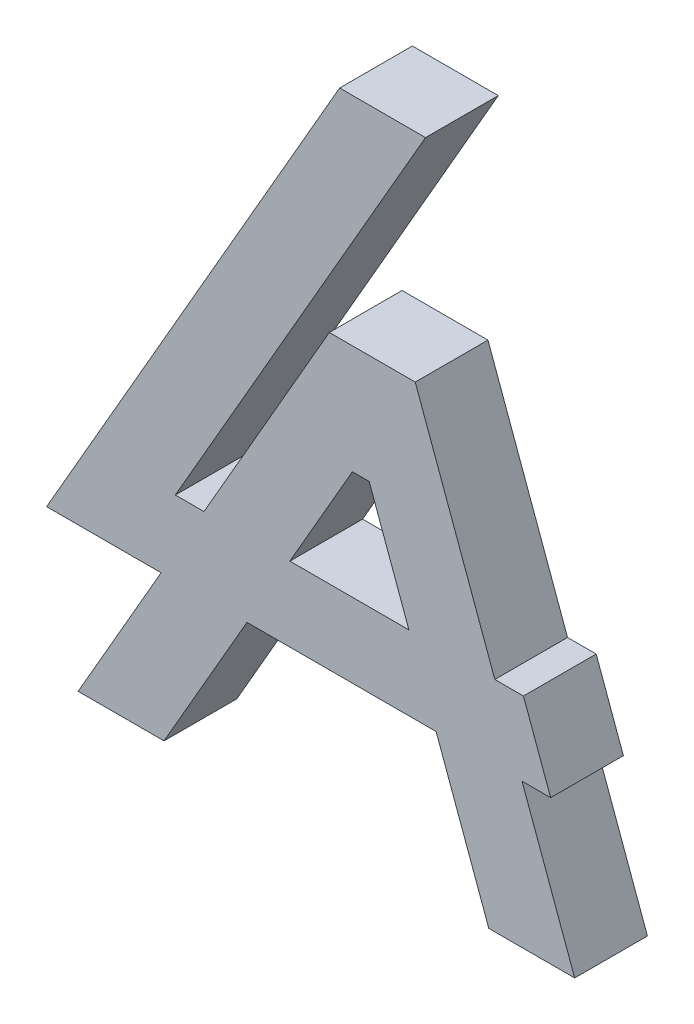
ISO-10303-21;
HEADER;
FILE_DESCRIPTION(('STEP AP214'),'2;1');
FILE_NAME('part.step','',(''),(''),'','','');
FILE_SCHEMA(('AUTOMOTIVE_DESIGN { 1 0 10303 214 1 1 1 1 }'));
ENDSEC;
DATA;
#1=APPLICATION_CONTEXT('core data for automotive mechanical design processes');
#2=APPLICATION_PROTOCOL_DEFINITION('international standard','automotive_design',2000,#1);
#3=PRODUCT_CONTEXT('',#1,'mechanical');
#4=PRODUCT('Part','Part','',(#3));
#5=PRODUCT_RELATED_PRODUCT_CATEGORY('part','',(#4));
#6=PRODUCT_DEFINITION_FORMATION('','',#4);
#7=PRODUCT_DEFINITION_CONTEXT('part definition',#1,'design');
#8=PRODUCT_DEFINITION('design','',#6,#7);
#9=PRODUCT_DEFINITION_SHAPE('','',#8);
#10=(LENGTH_UNIT() NAMED_UNIT(*) SI_UNIT(.MILLI.,.METRE.));
#11=(NAMED_UNIT(*) PLANE_ANGLE_UNIT() SI_UNIT($,.RADIAN.));
#12=(NAMED_UNIT(*) SI_UNIT($,.STERADIAN.) SOLID_ANGLE_UNIT());
#13=UNCERTAINTY_MEASURE_WITH_UNIT(LENGTH_MEASURE(1.E-05),#10,'distance_accuracy_value','');
#14=(GEOMETRIC_REPRESENTATION_CONTEXT(3) GLOBAL_UNCERTAINTY_ASSIGNED_CONTEXT((#13)) GLOBAL_UNIT_ASSIGNED_CONTEXT((#10,
#11,#12)) REPRESENTATION_CONTEXT('',''));
#15=CARTESIAN_POINT('',(0.,0.,0.));
#16=DIRECTION('',(0.,0.,1.));
#17=DIRECTION('',(1.,0.,0.));
#18=AXIS2_PLACEMENT_3D('',#15,#16,#17);
#19=CARTESIAN_POINT('',(-1.05562529478429,10.4156282279022,-6.985));
#20=DIRECTION('',(-0.866666666666667,0.498887651569859,0.));
#21=DIRECTION('',(-0.498887651569859,-0.866666666666667,0.));
#22=AXIS2_PLACEMENT_3D('',#19,#20,#21);
#23=PLANE('',#22);
#24=DIRECTION('',(-0.498887651569859,-0.866666666666667,0.));
#25=VECTOR('',#24,1.);
#26=CARTESIAN_POINT('',(-1.05562529478429,10.4156282279022,0.));
#27=LINE('',#26,#25);
#28=CARTESIAN_POINT('',(21.0946248020604,48.895,0.));
#29=VERTEX_POINT('',#28);
#30=CARTESIAN_POINT('',(-7.0512733404491,0.,0.));
#31=VERTEX_POINT('',#30);
#32=EDGE_CURVE('E229',#29,#31,#27,.T.);
#33=ORIENTED_EDGE('',*,*,#32,.F.);
#34=DIRECTION('',(0.,0.,1.));
#35=VECTOR('',#34,1.);
#36=CARTESIAN_POINT('',(21.0946248020604,48.895,-6.985));
#37=LINE('',#36,#35);
#38=CARTESIAN_POINT('',(21.0946248020604,48.895,-6.985));
#39=VERTEX_POINT('',#38);
#40=EDGE_CURVE('E47',#39,#29,#37,.T.);
#41=ORIENTED_EDGE('',*,*,#40,.F.);
#42=DIRECTION('',(-0.498887651569859,-0.866666666666667,0.));
#43=VECTOR('',#42,1.);
#44=CARTESIAN_POINT('',(21.0946248020604,48.895,-6.985));
#45=LINE('',#44,#43);
#46=CARTESIAN_POINT('',(-7.0512733404491,0.,-6.985));
#47=VERTEX_POINT('',#46);
#48=EDGE_CURVE('E277',#39,#47,#45,.T.);
#49=ORIENTED_EDGE('',*,*,#48,.T.);
#50=DIRECTION('',(0.,0.,1.));
#51=VECTOR('',#50,1.);
#52=CARTESIAN_POINT('',(-7.0512733404491,0.,-6.985));
#53=LINE('',#52,#51);
#54=EDGE_CURVE('E11',#47,#31,#53,.T.);
#55=ORIENTED_EDGE('',*,*,#54,.T.);
#56=EDGE_LOOP('',(#33,#41,#49,#55));
#57=FACE_BOUND('',#56,.T.);
#58=ADVANCED_FACE('F38',(#57),#23,.T.);
#59=CARTESIAN_POINT('',(29.3446248020604,48.895,-6.985));
#60=DIRECTION('',(0.,1.,0.));
#61=DIRECTION('',(0.,0.,1.));
#62=AXIS2_PLACEMENT_3D('',#59,#60,#61);
#63=PLANE('',#62);
#64=DIRECTION('',(-1.,0.,0.));
#65=VECTOR('',#64,1.);
#66=CARTESIAN_POINT('',(29.3446248020604,48.895,0.));
#67=LINE('',#66,#65);
#68=CARTESIAN_POINT('',(29.3446248020604,48.895,0.));
#69=VERTEX_POINT('',#68);
#70=EDGE_CURVE('E326',#69,#29,#67,.T.);
#71=ORIENTED_EDGE('',*,*,#70,.F.);
#72=DIRECTION('',(0.,0.,1.));
#73=VECTOR('',#72,1.);
#74=CARTESIAN_POINT('',(29.3446248020604,48.895,-6.985));
#75=LINE('',#74,#73);
#76=CARTESIAN_POINT('',(29.3446248020604,48.895,-6.985));
#77=VERTEX_POINT('',#76);
#78=EDGE_CURVE('E333',#77,#69,#75,.T.);
#79=ORIENTED_EDGE('',*,*,#78,.F.);
#80=DIRECTION('',(-1.,0.,0.));
#81=VECTOR('',#80,1.);
#82=CARTESIAN_POINT('',(29.3446248020604,48.895,-6.985));
#83=LINE('',#82,#81);
#84=EDGE_CURVE('E274',#77,#39,#83,.T.);
#85=ORIENTED_EDGE('',*,*,#84,.T.);
#86=ORIENTED_EDGE('',*,*,#40,.T.);
#87=EDGE_LOOP('',(#71,#79,#85,#86));
#88=FACE_BOUND('',#87,.T.);
#89=ADVANCED_FACE('F376',(#88),#63,.T.);
#90=CARTESIAN_POINT('',(5.31454978500219,7.15,-6.985));
#91=DIRECTION('',(0.866666666666666,-0.498887651569859,0.));
#92=DIRECTION('',(0.49888765156986,0.866666666666666,0.));
#93=AXIS2_PLACEMENT_3D('',#90,#91,#92);
#94=PLANE('',#93);
#95=DIRECTION('',(0.49888765156986,0.866666666666666,0.));
#96=VECTOR('',#95,1.);
#97=CARTESIAN_POINT('',(5.31454978500219,7.15,0.));
#98=LINE('',#97,#96);
#99=CARTESIAN_POINT('',(5.31454978500219,7.15,0.));
#100=VERTEX_POINT('',#99);
#101=EDGE_CURVE('E323',#100,#69,#98,.T.);
#102=ORIENTED_EDGE('',*,*,#101,.F.);
#103=DIRECTION('',(0.,0.,1.));
#104=VECTOR('',#103,1.);
#105=CARTESIAN_POINT('',(5.31454978500219,7.15,-6.985));
#106=LINE('',#105,#104);
#107=CARTESIAN_POINT('',(5.31454978500219,7.15,-6.985));
#108=VERTEX_POINT('',#107);
#109=EDGE_CURVE('E335',#108,#100,#106,.T.);
#110=ORIENTED_EDGE('',*,*,#109,.F.);
#111=DIRECTION('',(0.49888765156986,0.866666666666666,0.));
#112=VECTOR('',#111,1.);
#113=CARTESIAN_POINT('',(5.31454978500219,7.15,-6.985));
#114=LINE('',#113,#112);
#115=EDGE_CURVE('E271',#108,#77,#114,.T.);
#116=ORIENTED_EDGE('',*,*,#115,.T.);
#117=ORIENTED_EDGE('',*,*,#78,.T.);
#118=EDGE_LOOP('',(#102,#110,#116,#117));
#119=FACE_BOUND('',#118,.T.);
#120=ADVANCED_FACE('F382',(#119),#94,.T.);
#121=CARTESIAN_POINT('',(8.06454978500219,7.15,-6.985));
#122=DIRECTION('',(0.,1.,0.));
#123=DIRECTION('',(-1.,0.,0.));
#124=AXIS2_PLACEMENT_3D('',#121,#122,#123);
#125=PLANE('',#124);
#126=DIRECTION('',(-1.,0.,0.));
#127=VECTOR('',#126,1.);
#128=CARTESIAN_POINT('',(8.06454978500219,7.15,0.));
#129=LINE('',#128,#127);
#130=CARTESIAN_POINT('',(8.06454978500219,7.15,0.));
#131=VERTEX_POINT('',#130);
#132=EDGE_CURVE('E320',#131,#100,#129,.T.);
#133=ORIENTED_EDGE('',*,*,#132,.F.);
#134=DIRECTION('',(0.,0.,1.));
#135=VECTOR('',#134,1.);
#136=CARTESIAN_POINT('',(8.06454978500219,7.15,-6.985));
#137=LINE('',#136,#135);
#138=CARTESIAN_POINT('',(8.06454978500219,7.15,-6.985));
#139=VERTEX_POINT('',#138);
#140=EDGE_CURVE('E337',#139,#131,#137,.T.);
#141=ORIENTED_EDGE('',*,*,#140,.F.);
#142=DIRECTION('',(-1.,0.,0.));
#143=VECTOR('',#142,1.);
#144=CARTESIAN_POINT('',(8.06454978500219,7.15,-6.985));
#145=LINE('',#144,#143);
#146=EDGE_CURVE('E268',#139,#108,#145,.T.);
#147=ORIENTED_EDGE('',*,*,#146,.T.);
#148=ORIENTED_EDGE('',*,*,#109,.T.);
#149=EDGE_LOOP('',(#133,#141,#147,#148));
#150=FACE_BOUND('',#149,.T.);
#151=ADVANCED_FACE('F385',(#150),#125,.T.);
#152=CARTESIAN_POINT('',(20.1044421143438,28.0656777468061,-6.985));
#153=DIRECTION('',(-0.866666666666668,0.498887651569857,0.));
#154=DIRECTION('',(-0.498887651569857,-0.866666666666668,0.));
#155=AXIS2_PLACEMENT_3D('',#152,#153,#154);
#156=PLANE('',#155);
#157=DIRECTION('',(-0.498887651569857,-0.866666666666668,0.));
#158=VECTOR('',#157,1.);
#159=CARTESIAN_POINT('',(20.1044421143438,28.0656777468061,0.));
#160=LINE('',#159,#158);
#161=CARTESIAN_POINT('',(20.1044421143438,28.0656777468061,0.));
#162=VERTEX_POINT('',#161);
#163=EDGE_CURVE('E317',#162,#131,#160,.T.);
#164=ORIENTED_EDGE('',*,*,#163,.F.);
#165=DIRECTION('',(0.,0.,1.));
#166=VECTOR('',#165,1.);
#167=CARTESIAN_POINT('',(20.1044421143438,28.0656777468061,-6.985));
#168=LINE('',#167,#166);
#169=CARTESIAN_POINT('',(20.1044421143438,28.0656777468061,-6.985));
#170=VERTEX_POINT('',#169);
#171=EDGE_CURVE('E339',#170,#162,#168,.T.);
#172=ORIENTED_EDGE('',*,*,#171,.F.);
#173=DIRECTION('',(-0.498887651569857,-0.866666666666668,0.));
#174=VECTOR('',#173,1.);
#175=CARTESIAN_POINT('',(20.1044421143438,28.0656777468061,-6.985));
#176=LINE('',#175,#174);
#177=EDGE_CURVE('E265',#170,#139,#176,.T.);
#178=ORIENTED_EDGE('',*,*,#177,.T.);
#179=ORIENTED_EDGE('',*,*,#140,.T.);
#180=EDGE_LOOP('',(#164,#172,#178,#179));
#181=FACE_BOUND('',#180,.T.);
#182=ADVANCED_FACE('F390',(#181),#156,.T.);
#183=CARTESIAN_POINT('',(28.3544421143438,28.0656777468061,-6.985));
#184=DIRECTION('',(0.,1.,0.));
#185=DIRECTION('',(-1.,0.,0.));
#186=AXIS2_PLACEMENT_3D('',#183,#184,#185);
#187=PLANE('',#186);
#188=DIRECTION('',(-1.,0.,0.));
#189=VECTOR('',#188,1.);
#190=CARTESIAN_POINT('',(28.3544421143438,28.0656777468061,0.));
#191=LINE('',#190,#189);
#192=CARTESIAN_POINT('',(28.3544421143438,28.0656777468061,0.));
#193=VERTEX_POINT('',#192);
#194=EDGE_CURVE('E314',#193,#162,#191,.T.);
#195=ORIENTED_EDGE('',*,*,#194,.F.);
#196=DIRECTION('',(0.,0.,1.));
#197=VECTOR('',#196,1.);
#198=CARTESIAN_POINT('',(28.3544421143438,28.0656777468061,-6.985));
#199=LINE('',#198,#197);
#200=CARTESIAN_POINT('',(28.3544421143438,28.0656777468061,-6.985));
#201=VERTEX_POINT('',#200);
#202=EDGE_CURVE('E341',#201,#193,#199,.T.);
#203=ORIENTED_EDGE('',*,*,#202,.F.);
#204=DIRECTION('',(-1.,0.,0.));
#205=VECTOR('',#204,1.);
#206=CARTESIAN_POINT('',(28.3544421143438,28.0656777468061,-6.985));
#207=LINE('',#206,#205);
#208=EDGE_CURVE('E262',#201,#170,#207,.T.);
#209=ORIENTED_EDGE('',*,*,#208,.T.);
#210=ORIENTED_EDGE('',*,*,#171,.T.);
#211=EDGE_LOOP('',(#195,#203,#209,#210));
#212=FACE_BOUND('',#211,.T.);
#213=ADVANCED_FACE('F393',(#212),#187,.T.);
#214=CARTESIAN_POINT('',(35.9975528100126,7.15,-6.985));
#215=DIRECTION('',(0.939252708287435,0.343226382981725,0.));
#216=DIRECTION('',(-0.343226382981725,0.939252708287435,0.));
#217=AXIS2_PLACEMENT_3D('',#214,#215,#216);
#218=PLANE('',#217);
#219=DIRECTION('',(-0.343226382981725,0.939252708287435,0.));
#220=VECTOR('',#219,1.);
#221=CARTESIAN_POINT('',(35.9975528100126,7.15,0.));
#222=LINE('',#221,#220);
#223=CARTESIAN_POINT('',(35.9975528100126,7.15,0.));
#224=VERTEX_POINT('',#223);
#225=EDGE_CURVE('E311',#224,#193,#222,.T.);
#226=ORIENTED_EDGE('',*,*,#225,.F.);
#227=DIRECTION('',(0.,0.,1.));
#228=VECTOR('',#227,1.);
#229=CARTESIAN_POINT('',(35.9975528100126,7.15,-6.985));
#230=LINE('',#229,#228);
#231=CARTESIAN_POINT('',(35.9975528100126,7.15,-6.985));
#232=VERTEX_POINT('',#231);
#233=EDGE_CURVE('E343',#232,#224,#230,.T.);
#234=ORIENTED_EDGE('',*,*,#233,.F.);
#235=DIRECTION('',(-0.343226382981725,0.939252708287435,0.));
#236=VECTOR('',#235,1.);
#237=CARTESIAN_POINT('',(35.9975528100126,7.15,-6.985));
#238=LINE('',#237,#236);
#239=EDGE_CURVE('E259',#232,#201,#238,.T.);
#240=ORIENTED_EDGE('',*,*,#239,.T.);
#241=ORIENTED_EDGE('',*,*,#202,.T.);
#242=EDGE_LOOP('',(#226,#234,#240,#241));
#243=FACE_BOUND('',#242,.T.);
#244=ADVANCED_FACE('F398',(#243),#218,.T.);
#245=CARTESIAN_POINT('',(38.7475528100126,7.15,-6.985));
#246=DIRECTION('',(0.,1.,0.));
#247=DIRECTION('',(0.,0.,1.));
#248=AXIS2_PLACEMENT_3D('',#245,#246,#247);
#249=PLANE('',#248);
#250=DIRECTION('',(-1.,0.,0.));
#251=VECTOR('',#250,1.);
#252=CARTESIAN_POINT('',(38.7475528100126,7.15,0.));
#253=LINE('',#252,#251);
#254=CARTESIAN_POINT('',(38.7475528100126,7.15,0.));
#255=VERTEX_POINT('',#254);
#256=EDGE_CURVE('E308',#255,#224,#253,.T.);
#257=ORIENTED_EDGE('',*,*,#256,.F.);
#258=DIRECTION('',(0.,0.,1.));
#259=VECTOR('',#258,1.);
#260=CARTESIAN_POINT('',(38.7475528100126,7.15,-6.985));
#261=LINE('',#260,#259);
#262=CARTESIAN_POINT('',(38.7475528100126,7.15,-6.985));
#263=VERTEX_POINT('',#262);
#264=EDGE_CURVE('E345',#263,#255,#261,.T.);
#265=ORIENTED_EDGE('',*,*,#264,.F.);
#266=DIRECTION('',(-1.,0.,0.));
#267=VECTOR('',#266,1.);
#268=CARTESIAN_POINT('',(38.7475528100126,7.15,-6.985));
#269=LINE('',#268,#267);
#270=EDGE_CURVE('E256',#263,#232,#269,.T.);
#271=ORIENTED_EDGE('',*,*,#270,.T.);
#272=ORIENTED_EDGE('',*,*,#233,.T.);
#273=EDGE_LOOP('',(#257,#265,#271,#272));
#274=FACE_BOUND('',#273,.T.);
#275=ADVANCED_FACE('F401',(#274),#249,.T.);
#276=CARTESIAN_POINT('',(41.3603412711647,0.,-6.985));
#277=DIRECTION('',(0.93925270828744,0.343226382981713,0.));
#278=DIRECTION('',(-0.343226382981713,0.93925270828744,0.));
#279=AXIS2_PLACEMENT_3D('',#276,#277,#278);
#280=PLANE('',#279);
#281=DIRECTION('',(-0.343226382981713,0.93925270828744,0.));
#282=VECTOR('',#281,1.);
#283=CARTESIAN_POINT('',(41.3603412711647,0.,0.));
#284=LINE('',#283,#282);
#285=CARTESIAN_POINT('',(41.3603412711647,0.,0.));
#286=VERTEX_POINT('',#285);
#287=EDGE_CURVE('E305',#286,#255,#284,.T.);
#288=ORIENTED_EDGE('',*,*,#287,.F.);
#289=DIRECTION('',(0.,0.,1.));
#290=VECTOR('',#289,1.);
#291=CARTESIAN_POINT('',(41.3603412711647,0.,-6.985));
#292=LINE('',#291,#290);
#293=CARTESIAN_POINT('',(41.3603412711647,0.,-6.985));
#294=VERTEX_POINT('',#293);
#295=EDGE_CURVE('E347',#294,#286,#292,.T.);
#296=ORIENTED_EDGE('',*,*,#295,.F.);
#297=DIRECTION('',(-0.343226382981713,0.93925270828744,0.));
#298=VECTOR('',#297,1.);
#299=CARTESIAN_POINT('',(41.3603412711647,0.,-6.985));
#300=LINE('',#299,#298);
#301=EDGE_CURVE('E253',#294,#263,#300,.T.);
#302=ORIENTED_EDGE('',*,*,#301,.T.);
#303=ORIENTED_EDGE('',*,*,#264,.T.);
#304=EDGE_LOOP('',(#288,#296,#302,#303));
#305=FACE_BOUND('',#304,.T.);
#306=ADVANCED_FACE('F406',(#305),#280,.T.);
#307=CARTESIAN_POINT('',(38.6103412711647,0.,-6.985));
#308=DIRECTION('',(0.,-1.,0.));
#309=DIRECTION('',(1.,0.,0.));
#310=AXIS2_PLACEMENT_3D('',#307,#308,#309);
#311=PLANE('',#310);
#312=DIRECTION('',(1.,0.,0.));
#313=VECTOR('',#312,1.);
#314=CARTESIAN_POINT('',(38.6103412711647,0.,0.));
#315=LINE('',#314,#313);
#316=CARTESIAN_POINT('',(38.6103412711647,0.,0.));
#317=VERTEX_POINT('',#316);
#318=EDGE_CURVE('E302',#317,#286,#315,.T.);
#319=ORIENTED_EDGE('',*,*,#318,.F.);
#320=DIRECTION('',(0.,0.,1.));
#321=VECTOR('',#320,1.);
#322=CARTESIAN_POINT('',(38.6103412711647,0.,-6.985));
#323=LINE('',#322,#321);
#324=CARTESIAN_POINT('',(38.6103412711647,0.,-6.985));
#325=VERTEX_POINT('',#324);
#326=EDGE_CURVE('E349',#325,#317,#323,.T.);
#327=ORIENTED_EDGE('',*,*,#326,.F.);
#328=DIRECTION('',(1.,0.,0.));
#329=VECTOR('',#328,1.);
#330=CARTESIAN_POINT('',(38.6103412711647,0.,-6.985));
#331=LINE('',#330,#329);
#332=EDGE_CURVE('E250',#325,#294,#331,.T.);
#333=ORIENTED_EDGE('',*,*,#332,.T.);
#334=ORIENTED_EDGE('',*,*,#295,.T.);
#335=EDGE_LOOP('',(#319,#327,#333,#334));
#336=FACE_BOUND('',#335,.T.);
#337=ADVANCED_FACE('F409',(#336),#311,.T.);
#338=CARTESIAN_POINT('',(43.669402171251,-13.844322253194,-6.985));
#339=DIRECTION('',(0.939252708287437,0.343226382981722,0.));
#340=DIRECTION('',(-0.343226382981722,0.939252708287437,0.));
#341=AXIS2_PLACEMENT_3D('',#338,#339,#340);
#342=PLANE('',#341);
#343=DIRECTION('',(-0.343226382981722,0.939252708287436,0.));
#344=VECTOR('',#343,1.);
#345=CARTESIAN_POINT('',(43.669402171251,-13.844322253194,0.));
#346=LINE('',#345,#344);
#347=CARTESIAN_POINT('',(43.669402171251,-13.844322253194,0.));
#348=VERTEX_POINT('',#347);
#349=EDGE_CURVE('E299',#348,#317,#346,.T.);
#350=ORIENTED_EDGE('',*,*,#349,.F.);
#351=DIRECTION('',(0.,0.,1.));
#352=VECTOR('',#351,1.);
#353=CARTESIAN_POINT('',(43.669402171251,-13.844322253194,-6.985));
#354=LINE('',#353,#352);
#355=CARTESIAN_POINT('',(43.669402171251,-13.844322253194,-6.985));
#356=VERTEX_POINT('',#355);
#357=EDGE_CURVE('E351',#356,#348,#354,.T.);
#358=ORIENTED_EDGE('',*,*,#357,.F.);
#359=DIRECTION('',(-0.343226382981722,0.939252708287436,0.));
#360=VECTOR('',#359,1.);
#361=CARTESIAN_POINT('',(43.669402171251,-13.844322253194,-6.985));
#362=LINE('',#361,#360);
#363=EDGE_CURVE('E247',#356,#325,#362,.T.);
#364=ORIENTED_EDGE('',*,*,#363,.T.);
#365=ORIENTED_EDGE('',*,*,#326,.T.);
#366=EDGE_LOOP('',(#350,#358,#364,#365));
#367=FACE_BOUND('',#366,.T.);
#368=ADVANCED_FACE('F414',(#367),#342,.T.);
#369=CARTESIAN_POINT('',(35.419402171251,-13.844322253194,-6.985));
#370=DIRECTION('',(0.,-1.,0.));
#371=DIRECTION('',(0.,0.,-1.));
#372=AXIS2_PLACEMENT_3D('',#369,#370,#371);
#373=PLANE('',#372);
#374=DIRECTION('',(1.,0.,0.));
#375=VECTOR('',#374,1.);
#376=CARTESIAN_POINT('',(35.419402171251,-13.844322253194,0.));
#377=LINE('',#376,#375);
#378=CARTESIAN_POINT('',(35.419402171251,-13.844322253194,0.));
#379=VERTEX_POINT('',#378);
#380=EDGE_CURVE('E296',#379,#348,#377,.T.);
#381=ORIENTED_EDGE('',*,*,#380,.F.);
#382=DIRECTION('',(0.,0.,1.));
#383=VECTOR('',#382,1.);
#384=CARTESIAN_POINT('',(35.419402171251,-13.844322253194,-6.985));
#385=LINE('',#384,#383);
#386=CARTESIAN_POINT('',(35.419402171251,-13.844322253194,-6.985));
#387=VERTEX_POINT('',#386);
#388=EDGE_CURVE('E353',#387,#379,#385,.T.);
#389=ORIENTED_EDGE('',*,*,#388,.F.);
#390=DIRECTION('',(1.,0.,0.));
#391=VECTOR('',#390,1.);
#392=CARTESIAN_POINT('',(35.419402171251,-13.844322253194,-6.985));
#393=LINE('',#392,#391);
#394=EDGE_CURVE('E244',#387,#356,#393,.T.);
#395=ORIENTED_EDGE('',*,*,#394,.T.);
#396=ORIENTED_EDGE('',*,*,#357,.T.);
#397=EDGE_LOOP('',(#381,#389,#395,#396));
#398=FACE_BOUND('',#397,.T.);
#399=ADVANCED_FACE('F417',(#398),#373,.T.);
#400=CARTESIAN_POINT('',(30.3603412711647,0.,-6.985));
#401=DIRECTION('',(-0.939252708287436,-0.343226382981722,0.));
#402=DIRECTION('',(0.343226382981722,-0.939252708287436,0.));
#403=AXIS2_PLACEMENT_3D('',#400,#401,#402);
#404=PLANE('',#403);
#405=DIRECTION('',(0.343226382981722,-0.939252708287436,0.));
#406=VECTOR('',#405,1.);
#407=CARTESIAN_POINT('',(30.3603412711647,0.,0.));
#408=LINE('',#407,#406);
#409=CARTESIAN_POINT('',(30.3603412711647,0.,0.));
#410=VERTEX_POINT('',#409);
#411=EDGE_CURVE('E293',#410,#379,#408,.T.);
#412=ORIENTED_EDGE('',*,*,#411,.F.);
#413=DIRECTION('',(0.,0.,1.));
#414=VECTOR('',#413,1.);
#415=CARTESIAN_POINT('',(30.3603412711647,0.,-6.985));
#416=LINE('',#415,#414);
#417=CARTESIAN_POINT('',(30.3603412711647,0.,-6.985));
#418=VERTEX_POINT('',#417);
#419=EDGE_CURVE('E355',#418,#410,#416,.T.);
#420=ORIENTED_EDGE('',*,*,#419,.F.);
#421=DIRECTION('',(0.343226382981722,-0.939252708287436,0.));
#422=VECTOR('',#421,1.);
#423=CARTESIAN_POINT('',(30.3603412711647,0.,-6.985));
#424=LINE('',#423,#422);
#425=EDGE_CURVE('E241',#418,#387,#424,.T.);
#426=ORIENTED_EDGE('',*,*,#425,.T.);
#427=ORIENTED_EDGE('',*,*,#388,.T.);
#428=EDGE_LOOP('',(#412,#420,#426,#427));
#429=FACE_BOUND('',#428,.T.);
#430=ADVANCED_FACE('F422',(#429),#404,.T.);
#431=CARTESIAN_POINT('',(12.1987266595509,0.,-6.985));
#432=DIRECTION('',(0.,-1.,0.));
#433=DIRECTION('',(1.,0.,0.));
#434=AXIS2_PLACEMENT_3D('',#431,#432,#433);
#435=PLANE('',#434);
#436=DIRECTION('',(1.,0.,0.));
#437=VECTOR('',#436,1.);
#438=CARTESIAN_POINT('',(12.1987266595509,0.,0.));
#439=LINE('',#438,#437);
#440=CARTESIAN_POINT('',(12.1987266595509,0.,0.));
#441=VERTEX_POINT('',#440);
#442=EDGE_CURVE('E290',#441,#410,#439,.T.);
#443=ORIENTED_EDGE('',*,*,#442,.F.);
#444=DIRECTION('',(0.,0.,1.));
#445=VECTOR('',#444,1.);
#446=CARTESIAN_POINT('',(12.1987266595509,0.,-6.985));
#447=LINE('',#446,#445);
#448=CARTESIAN_POINT('',(12.1987266595509,0.,-6.985));
#449=VERTEX_POINT('',#448);
#450=EDGE_CURVE('E357',#449,#441,#447,.T.);
#451=ORIENTED_EDGE('',*,*,#450,.F.);
#452=DIRECTION('',(1.,0.,0.));
#453=VECTOR('',#452,1.);
#454=CARTESIAN_POINT('',(12.1987266595509,0.,-6.985));
#455=LINE('',#454,#453);
#456=EDGE_CURVE('E238',#449,#418,#455,.T.);
#457=ORIENTED_EDGE('',*,*,#456,.T.);
#458=ORIENTED_EDGE('',*,*,#419,.T.);
#459=EDGE_LOOP('',(#443,#451,#457,#458));
#460=FACE_BOUND('',#459,.T.);
#461=ADVANCED_FACE('F425',(#460),#435,.T.);
#462=CARTESIAN_POINT('',(4.22938656362128,-13.844322253194,-6.985));
#463=DIRECTION('',(0.866666666666667,-0.498887651569859,0.));
#464=DIRECTION('',(0.498887651569859,0.866666666666667,0.));
#465=AXIS2_PLACEMENT_3D('',#462,#463,#464);
#466=PLANE('',#465);
#467=DIRECTION('',(0.498887651569859,0.866666666666667,0.));
#468=VECTOR('',#467,1.);
#469=CARTESIAN_POINT('',(4.22938656362128,-13.844322253194,0.));
#470=LINE('',#469,#468);
#471=CARTESIAN_POINT('',(4.22938656362128,-13.844322253194,0.));
#472=VERTEX_POINT('',#471);
#473=EDGE_CURVE('E287',#472,#441,#470,.T.);
#474=ORIENTED_EDGE('',*,*,#473,.F.);
#475=DIRECTION('',(0.,0.,1.));
#476=VECTOR('',#475,1.);
#477=CARTESIAN_POINT('',(4.22938656362128,-13.844322253194,-6.985));
#478=LINE('',#477,#476);
#479=CARTESIAN_POINT('',(4.22938656362128,-13.844322253194,-6.985));
#480=VERTEX_POINT('',#479);
#481=EDGE_CURVE('E359',#480,#472,#478,.T.);
#482=ORIENTED_EDGE('',*,*,#481,.F.);
#483=DIRECTION('',(0.498887651569859,0.866666666666667,0.));
#484=VECTOR('',#483,1.);
#485=CARTESIAN_POINT('',(4.22938656362128,-13.844322253194,-6.985));
#486=LINE('',#485,#484);
#487=EDGE_CURVE('E235',#480,#449,#486,.T.);
#488=ORIENTED_EDGE('',*,*,#487,.T.);
#489=ORIENTED_EDGE('',*,*,#450,.T.);
#490=EDGE_LOOP('',(#474,#482,#488,#489));
#491=FACE_BOUND('',#490,.T.);
#492=ADVANCED_FACE('F430',(#491),#466,.T.);
#493=CARTESIAN_POINT('',(-4.02061343637872,-13.844322253194,-6.985));
#494=DIRECTION('',(0.,-1.,0.));
#495=DIRECTION('',(0.,0.,-1.));
#496=AXIS2_PLACEMENT_3D('',#493,#494,#495);
#497=PLANE('',#496);
#498=DIRECTION('',(1.,0.,0.));
#499=VECTOR('',#498,1.);
#500=CARTESIAN_POINT('',(-4.02061343637872,-13.844322253194,0.));
#501=LINE('',#500,#499);
#502=CARTESIAN_POINT('',(-4.02061343637872,-13.844322253194,0.));
#503=VERTEX_POINT('',#502);
#504=EDGE_CURVE('E284',#503,#472,#501,.T.);
#505=ORIENTED_EDGE('',*,*,#504,.F.);
#506=DIRECTION('',(0.,0.,1.));
#507=VECTOR('',#506,1.);
#508=CARTESIAN_POINT('',(-4.02061343637872,-13.844322253194,-6.985));
#509=LINE('',#508,#507);
#510=CARTESIAN_POINT('',(-4.02061343637872,-13.844322253194,-6.985));
#511=VERTEX_POINT('',#510);
#512=EDGE_CURVE('E360',#511,#503,#509,.T.);
#513=ORIENTED_EDGE('',*,*,#512,.F.);
#514=DIRECTION('',(1.,0.,0.));
#515=VECTOR('',#514,1.);
#516=CARTESIAN_POINT('',(-4.02061343637872,-13.844322253194,-6.985));
#517=LINE('',#516,#515);
#518=EDGE_CURVE('E232',#511,#480,#517,.T.);
#519=ORIENTED_EDGE('',*,*,#518,.T.);
#520=ORIENTED_EDGE('',*,*,#481,.T.);
#521=EDGE_LOOP('',(#505,#513,#519,#520));
#522=FACE_BOUND('',#521,.T.);
#523=ADVANCED_FACE('F432',(#522),#497,.T.);
#524=CARTESIAN_POINT('',(3.94872665955086,0.,-6.985));
#525=DIRECTION('',(-0.866666666666666,0.498887651569859,0.));
#526=DIRECTION('',(-0.498887651569859,-0.866666666666667,0.));
#527=AXIS2_PLACEMENT_3D('',#524,#525,#526);
#528=PLANE('',#527);
#529=DIRECTION('',(-0.498887651569859,-0.866666666666667,0.));
#530=VECTOR('',#529,1.);
#531=CARTESIAN_POINT('',(3.94872665955086,0.,0.));
#532=LINE('',#531,#530);
#533=CARTESIAN_POINT('',(3.94872665955086,0.,0.));
#534=VERTEX_POINT('',#533);
#535=EDGE_CURVE('E281',#534,#503,#532,.T.);
#536=ORIENTED_EDGE('',*,*,#535,.F.);
#537=DIRECTION('',(0.,0.,1.));
#538=VECTOR('',#537,1.);
#539=CARTESIAN_POINT('',(3.94872665955086,0.,-6.985));
#540=LINE('',#539,#538);
#541=CARTESIAN_POINT('',(3.94872665955086,0.,-6.985));
#542=VERTEX_POINT('',#541);
#543=EDGE_CURVE('E42',#542,#534,#540,.T.);
#544=ORIENTED_EDGE('',*,*,#543,.F.);
#545=DIRECTION('',(-0.498887651569859,-0.866666666666667,0.));
#546=VECTOR('',#545,1.);
#547=CARTESIAN_POINT('',(3.94872665955086,0.,-6.985));
#548=LINE('',#547,#546);
#549=EDGE_CURVE('E228',#542,#511,#548,.T.);
#550=ORIENTED_EDGE('',*,*,#549,.T.);
#551=ORIENTED_EDGE('',*,*,#512,.T.);
#552=EDGE_LOOP('',(#536,#544,#550,#551));
#553=FACE_BOUND('',#552,.T.);
#554=ADVANCED_FACE('F369',(#553),#528,.T.);
#555=CARTESIAN_POINT('',(0.,0.,-6.985));
#556=DIRECTION('',(0.,-1.,0.));
#557=DIRECTION('',(0.,0.,-1.));
#558=AXIS2_PLACEMENT_3D('',#555,#556,#557);
#559=PLANE('',#558);
#560=DIRECTION('',(1.,0.,0.));
#561=VECTOR('',#560,1.);
#562=CARTESIAN_POINT('',(0.,0.,0.));
#563=LINE('',#562,#561);
#564=EDGE_CURVE('E222',#31,#534,#563,.T.);
#565=ORIENTED_EDGE('',*,*,#564,.F.);
#566=ORIENTED_EDGE('',*,*,#54,.F.);
#567=DIRECTION('',(1.,0.,0.));
#568=VECTOR('',#567,1.);
#569=CARTESIAN_POINT('',(-7.0512733404491,0.,-6.985));
#570=LINE('',#569,#568);
#571=EDGE_CURVE('E226',#47,#542,#570,.T.);
#572=ORIENTED_EDGE('',*,*,#571,.T.);
#573=ORIENTED_EDGE('',*,*,#543,.T.);
#574=EDGE_LOOP('',(#565,#566,#572,#573));
#575=FACE_BOUND('',#574,.T.);
#576=ADVANCED_FACE('F40',(#575),#559,.T.);
#577=CARTESIAN_POINT('',(0.,0.,-6.985));
#578=DIRECTION('',(0.,0.,-1.));
#579=DIRECTION('',(-1.,0.,0.));
#580=AXIS2_PLACEMENT_3D('',#577,#578,#579);
#581=PLANE('',#580);
#582=DIRECTION('',(-0.498887651569859,-0.866666666666667,0.));
#583=VECTOR('',#582,1.);
#584=CARTESIAN_POINT('',(22.3232901338416,17.5883721517408,-6.985));
#585=LINE('',#584,#583);
#586=CARTESIAN_POINT('',(22.3232901338416,17.5883721517408,-6.985));
#587=VERTEX_POINT('',#586);
#588=CARTESIAN_POINT('',(16.3145497850022,7.15,-6.985));
#589=VERTEX_POINT('',#588);
#590=EDGE_CURVE('E191',#587,#589,#585,.T.);
#591=ORIENTED_EDGE('',*,*,#590,.T.);
#592=DIRECTION('',(1.,0.,0.));
#593=VECTOR('',#592,1.);
#594=CARTESIAN_POINT('',(16.3145497850022,7.15,-6.985));
#595=LINE('',#594,#593);
#596=CARTESIAN_POINT('',(27.7475528100125,7.15,-6.985));
#597=VERTEX_POINT('',#596);
#598=EDGE_CURVE('E200',#589,#597,#595,.T.);
#599=ORIENTED_EDGE('',*,*,#598,.T.);
#600=DIRECTION('',(-0.343226382981722,0.939252708287436,0.));
#601=VECTOR('',#600,1.);
#602=CARTESIAN_POINT('',(27.7475528100125,7.15,-6.985));
#603=LINE('',#602,#601);
#604=CARTESIAN_POINT('',(23.9331110881551,17.5883721517408,-6.985));
#605=VERTEX_POINT('',#604);
#606=EDGE_CURVE('E55',#597,#605,#603,.T.);
#607=ORIENTED_EDGE('',*,*,#606,.T.);
#608=DIRECTION('',(-1.,0.,0.));
#609=VECTOR('',#608,1.);
#610=CARTESIAN_POINT('',(23.9331110881551,17.5883721517408,-6.985));
#611=LINE('',#610,#609);
#612=EDGE_CURVE('E197',#605,#587,#611,.T.);
#613=ORIENTED_EDGE('',*,*,#612,.T.);
#614=EDGE_LOOP('',(#591,#599,#607,#613));
#615=FACE_BOUND('',#614,.T.);
#616=ORIENTED_EDGE('',*,*,#571,.F.);
#617=ORIENTED_EDGE('',*,*,#48,.F.);
#618=ORIENTED_EDGE('',*,*,#84,.F.);
#619=ORIENTED_EDGE('',*,*,#115,.F.);
#620=ORIENTED_EDGE('',*,*,#146,.F.);
#621=ORIENTED_EDGE('',*,*,#177,.F.);
#622=ORIENTED_EDGE('',*,*,#208,.F.);
#623=ORIENTED_EDGE('',*,*,#239,.F.);
#624=ORIENTED_EDGE('',*,*,#270,.F.);
#625=ORIENTED_EDGE('',*,*,#301,.F.);
#626=ORIENTED_EDGE('',*,*,#332,.F.);
#627=ORIENTED_EDGE('',*,*,#363,.F.);
#628=ORIENTED_EDGE('',*,*,#394,.F.);
#629=ORIENTED_EDGE('',*,*,#425,.F.);
#630=ORIENTED_EDGE('',*,*,#456,.F.);
#631=ORIENTED_EDGE('',*,*,#487,.F.);
#632=ORIENTED_EDGE('',*,*,#518,.F.);
#633=ORIENTED_EDGE('',*,*,#549,.F.);
#634=EDGE_LOOP('',(#616,#617,#618,#619,#620,#621,#622,#623,#624,#625,#626,#627,#628,#629,#630,
#631,#632,#633));
#635=FACE_BOUND('',#634,.T.);
#636=ADVANCED_FACE('F204',(#615,#635),#581,.T.);
#637=CARTESIAN_POINT('',(0.,0.,0.));
#638=DIRECTION('',(0.,0.,-1.));
#639=DIRECTION('',(-1.,0.,0.));
#640=AXIS2_PLACEMENT_3D('',#637,#638,#639);
#641=PLANE('',#640);
#642=DIRECTION('',(1.,0.,0.));
#643=VECTOR('',#642,1.);
#644=CARTESIAN_POINT('',(16.3145497850022,7.15,0.));
#645=LINE('',#644,#643);
#646=CARTESIAN_POINT('',(16.3145497850022,7.15,0.));
#647=VERTEX_POINT('',#646);
#648=CARTESIAN_POINT('',(27.7475528100125,7.15,0.));
#649=VERTEX_POINT('',#648);
#650=EDGE_CURVE('E216',#647,#649,#645,.T.);
#651=ORIENTED_EDGE('',*,*,#650,.F.);
#652=DIRECTION('',(-0.498887651569859,-0.866666666666667,0.));
#653=VECTOR('',#652,1.);
#654=CARTESIAN_POINT('',(22.3232901338416,17.5883721517408,0.));
#655=LINE('',#654,#653);
#656=CARTESIAN_POINT('',(22.3232901338416,17.5883721517408,0.));
#657=VERTEX_POINT('',#656);
#658=EDGE_CURVE('E63',#657,#647,#655,.T.);
#659=ORIENTED_EDGE('',*,*,#658,.F.);
#660=DIRECTION('',(-1.,0.,0.));
#661=VECTOR('',#660,1.);
#662=CARTESIAN_POINT('',(23.9331110881551,17.5883721517408,0.));
#663=LINE('',#662,#661);
#664=CARTESIAN_POINT('',(23.9331110881551,17.5883721517408,0.));
#665=VERTEX_POINT('',#664);
#666=EDGE_CURVE('E207',#665,#657,#663,.T.);
#667=ORIENTED_EDGE('',*,*,#666,.F.);
#668=DIRECTION('',(-0.343226382981722,0.939252708287436,0.));
#669=VECTOR('',#668,1.);
#670=CARTESIAN_POINT('',(27.7475528100125,7.15,0.));
#671=LINE('',#670,#669);
#672=EDGE_CURVE('E210',#649,#665,#671,.T.);
#673=ORIENTED_EDGE('',*,*,#672,.F.);
#674=EDGE_LOOP('',(#651,#659,#667,#673));
#675=FACE_BOUND('',#674,.T.);
#676=ORIENTED_EDGE('',*,*,#32,.T.);
#677=ORIENTED_EDGE('',*,*,#564,.T.);
#678=ORIENTED_EDGE('',*,*,#535,.T.);
#679=ORIENTED_EDGE('',*,*,#504,.T.);
#680=ORIENTED_EDGE('',*,*,#473,.T.);
#681=ORIENTED_EDGE('',*,*,#442,.T.);
#682=ORIENTED_EDGE('',*,*,#411,.T.);
#683=ORIENTED_EDGE('',*,*,#380,.T.);
#684=ORIENTED_EDGE('',*,*,#349,.T.);
#685=ORIENTED_EDGE('',*,*,#318,.T.);
#686=ORIENTED_EDGE('',*,*,#287,.T.);
#687=ORIENTED_EDGE('',*,*,#256,.T.);
#688=ORIENTED_EDGE('',*,*,#225,.T.);
#689=ORIENTED_EDGE('',*,*,#194,.T.);
#690=ORIENTED_EDGE('',*,*,#163,.T.);
#691=ORIENTED_EDGE('',*,*,#132,.T.);
#692=ORIENTED_EDGE('',*,*,#101,.T.);
#693=ORIENTED_EDGE('',*,*,#70,.T.);
#694=EDGE_LOOP('',(#676,#677,#678,#679,#680,#681,#682,#683,#684,#685,#686,#687,#688,#689,#690,
#691,#692,#693));
#695=FACE_BOUND('',#694,.T.);
#696=ADVANCED_FACE('F371',(#675,#695),#641,.F.);
#697=CARTESIAN_POINT('',(22.3232901338416,17.5883721517408,-6.985));
#698=DIRECTION('',(-0.866666666666667,0.498887651569859,0.));
#699=DIRECTION('',(-0.498887651569859,-0.866666666666667,0.));
#700=AXIS2_PLACEMENT_3D('',#697,#698,#699);
#701=PLANE('',#700);
#702=ORIENTED_EDGE('',*,*,#658,.T.);
#703=DIRECTION('',(0.,0.,1.));
#704=VECTOR('',#703,1.);
#705=CARTESIAN_POINT('',(16.3145497850022,7.15,-6.985));
#706=LINE('',#705,#704);
#707=EDGE_CURVE('E187',#589,#647,#706,.T.);
#708=ORIENTED_EDGE('',*,*,#707,.F.);
#709=ORIENTED_EDGE('',*,*,#590,.F.);
#710=DIRECTION('',(0.,0.,1.));
#711=VECTOR('',#710,1.);
#712=CARTESIAN_POINT('',(22.3232901338416,17.5883721517408,-6.985));
#713=LINE('',#712,#711);
#714=EDGE_CURVE('E220',#587,#657,#713,.T.);
#715=ORIENTED_EDGE('',*,*,#714,.T.);
#716=EDGE_LOOP('',(#702,#708,#709,#715));
#717=FACE_BOUND('',#716,.T.);
#718=ADVANCED_FACE('F189',(#717),#701,.F.);
#719=CARTESIAN_POINT('',(23.9331110881551,17.5883721517408,-6.985));
#720=DIRECTION('',(0.,1.,0.));
#721=DIRECTION('',(0.,0.,1.));
#722=AXIS2_PLACEMENT_3D('',#719,#720,#721);
#723=PLANE('',#722);
#724=ORIENTED_EDGE('',*,*,#666,.T.);
#725=ORIENTED_EDGE('',*,*,#714,.F.);
#726=ORIENTED_EDGE('',*,*,#612,.F.);
#727=DIRECTION('',(0.,0.,1.));
#728=VECTOR('',#727,1.);
#729=CARTESIAN_POINT('',(23.9331110881551,17.5883721517408,-6.985));
#730=LINE('',#729,#728);
#731=EDGE_CURVE('E223',#605,#665,#730,.T.);
#732=ORIENTED_EDGE('',*,*,#731,.T.);
#733=EDGE_LOOP('',(#724,#725,#726,#732));
#734=FACE_BOUND('',#733,.T.);
#735=ADVANCED_FACE('F527',(#734),#723,.F.);
#736=CARTESIAN_POINT('',(27.7475528100125,7.15,-6.985));
#737=DIRECTION('',(0.939252708287436,0.343226382981722,0.));
#738=DIRECTION('',(-0.343226382981722,0.939252708287436,0.));
#739=AXIS2_PLACEMENT_3D('',#736,#737,#738);
#740=PLANE('',#739);
#741=ORIENTED_EDGE('',*,*,#672,.T.);
#742=ORIENTED_EDGE('',*,*,#731,.F.);
#743=ORIENTED_EDGE('',*,*,#606,.F.);
#744=DIRECTION('',(0.,0.,1.));
#745=VECTOR('',#744,1.);
#746=CARTESIAN_POINT('',(27.7475528100125,7.15,-6.985));
#747=LINE('',#746,#745);
#748=EDGE_CURVE('E196',#597,#649,#747,.T.);
#749=ORIENTED_EDGE('',*,*,#748,.T.);
#750=EDGE_LOOP('',(#741,#742,#743,#749));
#751=FACE_BOUND('',#750,.T.);
#752=ADVANCED_FACE('F537',(#751),#740,.F.);
#753=CARTESIAN_POINT('',(16.3145497850022,7.15,-6.985));
#754=DIRECTION('',(0.,-1.,0.));
#755=DIRECTION('',(1.,0.,0.));
#756=AXIS2_PLACEMENT_3D('',#753,#754,#755);
#757=PLANE('',#756);
#758=ORIENTED_EDGE('',*,*,#650,.T.);
#759=ORIENTED_EDGE('',*,*,#748,.F.);
#760=ORIENTED_EDGE('',*,*,#598,.F.);
#761=ORIENTED_EDGE('',*,*,#707,.T.);
#762=EDGE_LOOP('',(#758,#759,#760,#761));
#763=FACE_BOUND('',#762,.T.);
#764=ADVANCED_FACE('F201',(#763),#757,.F.);
#765=CLOSED_SHELL('',(#58,#89,#120,#151,#182,#213,#244,#275,#306,#337,#368,#399,#430,#461,#492,
#523,#554,#576,#636,#696,#718,#735,#752,#764));
#766=MANIFOLD_SOLID_BREP('B2',#765);
#767=ADVANCED_BREP_SHAPE_REPRESENTATION('',(#18,#766),#14);
#768=SHAPE_DEFINITION_REPRESENTATION(#9,#767);
ENDSEC;
END-ISO-10303-21;
